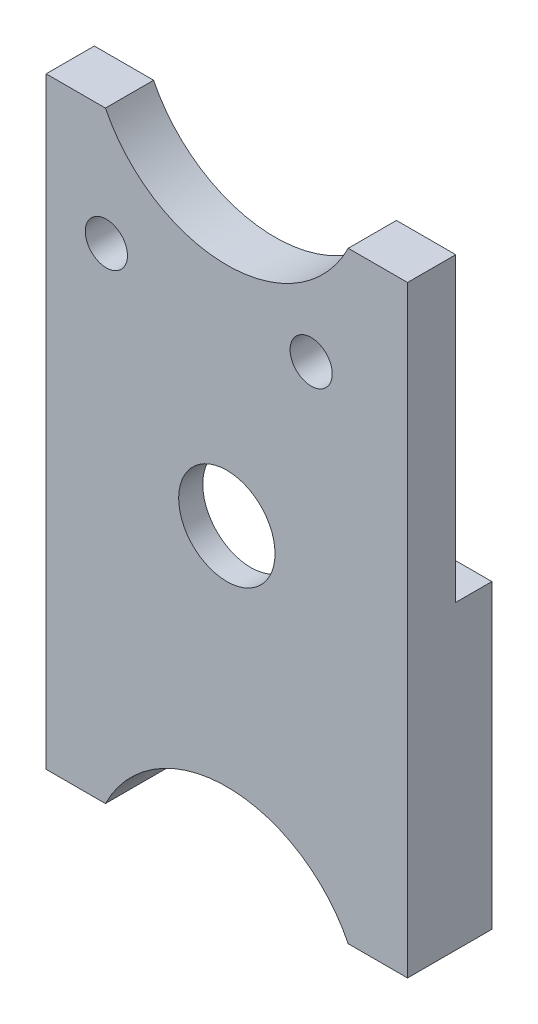
ISO-10303-21;
HEADER;
FILE_DESCRIPTION(('STEP AP214'),'2;1');
FILE_NAME('part.step','',(''),(''),'','','');
FILE_SCHEMA(('AUTOMOTIVE_DESIGN { 1 0 10303 214 1 1 1 1 }'));
ENDSEC;
DATA;
#1=APPLICATION_CONTEXT('core data for automotive mechanical design processes');
#2=APPLICATION_PROTOCOL_DEFINITION('international standard','automotive_design',2000,#1);
#3=PRODUCT_CONTEXT('',#1,'mechanical');
#4=PRODUCT('Part','Part','',(#3));
#5=PRODUCT_RELATED_PRODUCT_CATEGORY('part','',(#4));
#6=PRODUCT_DEFINITION_FORMATION('','',#4);
#7=PRODUCT_DEFINITION_CONTEXT('part definition',#1,'design');
#8=PRODUCT_DEFINITION('design','',#6,#7);
#9=PRODUCT_DEFINITION_SHAPE('','',#8);
#10=(LENGTH_UNIT() NAMED_UNIT(*) SI_UNIT(.MILLI.,.METRE.));
#11=(NAMED_UNIT(*) PLANE_ANGLE_UNIT() SI_UNIT($,.RADIAN.));
#12=(NAMED_UNIT(*) SI_UNIT($,.STERADIAN.) SOLID_ANGLE_UNIT());
#13=UNCERTAINTY_MEASURE_WITH_UNIT(LENGTH_MEASURE(1.E-05),#10,'distance_accuracy_value','');
#14=(GEOMETRIC_REPRESENTATION_CONTEXT(3) GLOBAL_UNCERTAINTY_ASSIGNED_CONTEXT((#13)) GLOBAL_UNIT_ASSIGNED_CONTEXT((#10,
#11,#12)) REPRESENTATION_CONTEXT('',''));
#15=CARTESIAN_POINT('',(0.,0.,0.));
#16=DIRECTION('',(0.,0.,1.));
#17=DIRECTION('',(1.,0.,0.));
#18=AXIS2_PLACEMENT_3D('',#15,#16,#17);
#19=CARTESIAN_POINT('',(0.,0.,7.));
#20=DIRECTION('',(0.,0.,-1.));
#21=DIRECTION('',(-1.,0.,0.));
#22=AXIS2_PLACEMENT_3D('',#19,#20,#21);
#23=CYLINDRICAL_SURFACE('',#22,4.);
#24=CARTESIAN_POINT('',(0.,0.,7.));
#25=DIRECTION('',(0.,0.,1.));
#26=DIRECTION('',(1.,0.,0.));
#27=AXIS2_PLACEMENT_3D('',#24,#25,#26);
#28=CIRCLE('',#27,4.);
#29=CARTESIAN_POINT('',(4.,0.,7.));
#30=VERTEX_POINT('',#29);
#31=EDGE_CURVE('E137',#30,#30,#28,.T.);
#32=ORIENTED_EDGE('',*,*,#31,.T.);
#33=EDGE_LOOP('',(#32));
#34=FACE_BOUND('',#33,.T.);
#35=CARTESIAN_POINT('',(0.,0.,5.));
#36=DIRECTION('',(0.,0.,-1.));
#37=DIRECTION('',(-1.,0.,0.));
#38=AXIS2_PLACEMENT_3D('',#35,#36,#37);
#39=CIRCLE('',#38,4.);
#40=CARTESIAN_POINT('',(-4.,0.,5.));
#41=VERTEX_POINT('',#40);
#42=EDGE_CURVE('E43',#41,#41,#39,.T.);
#43=ORIENTED_EDGE('',*,*,#42,.T.);
#44=EDGE_LOOP('',(#43));
#45=FACE_BOUND('',#44,.T.);
#46=ADVANCED_FACE('F39',(#34,#45),#23,.F.);
#47=CARTESIAN_POINT('',(10.0778221853732,25.,7.));
#48=DIRECTION('',(0.,-1.,0.));
#49=DIRECTION('',(0.,0.,-1.));
#50=AXIS2_PLACEMENT_3D('',#47,#48,#49);
#51=PLANE('',#50);
#52=DIRECTION('',(1.,0.,0.));
#53=VECTOR('',#52,1.);
#54=CARTESIAN_POINT('',(15.,25.,3.));
#55=LINE('',#54,#53);
#56=CARTESIAN_POINT('',(10.0778221853732,25.,3.));
#57=VERTEX_POINT('',#56);
#58=CARTESIAN_POINT('',(15.,25.,3.));
#59=VERTEX_POINT('',#58);
#60=EDGE_CURVE('E241',#57,#59,#55,.T.);
#61=ORIENTED_EDGE('',*,*,#60,.F.);
#62=DIRECTION('',(0.,0.,-1.));
#63=VECTOR('',#62,1.);
#64=CARTESIAN_POINT('',(10.0778221853732,25.,7.));
#65=LINE('',#64,#63);
#66=CARTESIAN_POINT('',(10.0778221853732,25.,7.));
#67=VERTEX_POINT('',#66);
#68=EDGE_CURVE('E48',#67,#57,#65,.T.);
#69=ORIENTED_EDGE('',*,*,#68,.F.);
#70=DIRECTION('',(-1.,0.,0.));
#71=VECTOR('',#70,1.);
#72=CARTESIAN_POINT('',(10.0778221853732,25.,7.));
#73=LINE('',#72,#71);
#74=CARTESIAN_POINT('',(15.,25.,7.));
#75=VERTEX_POINT('',#74);
#76=EDGE_CURVE('E144',#75,#67,#73,.T.);
#77=ORIENTED_EDGE('',*,*,#76,.F.);
#78=DIRECTION('',(0.,0.,-1.));
#79=VECTOR('',#78,1.);
#80=CARTESIAN_POINT('',(15.,25.,7.));
#81=LINE('',#80,#79);
#82=EDGE_CURVE('E130',#75,#59,#81,.T.);
#83=ORIENTED_EDGE('',*,*,#82,.T.);
#84=EDGE_LOOP('',(#61,#69,#77,#83));
#85=FACE_BOUND('',#84,.T.);
#86=ADVANCED_FACE('F41',(#85),#51,.F.);
#87=CARTESIAN_POINT('',(0.,30.,7.));
#88=DIRECTION('',(0.,0.,-1.));
#89=DIRECTION('',(-1.,0.,0.));
#90=AXIS2_PLACEMENT_3D('',#87,#88,#89);
#91=CYLINDRICAL_SURFACE('',#90,11.25);
#92=CARTESIAN_POINT('',(0.,30.,3.));
#93=DIRECTION('',(0.,0.,-1.));
#94=DIRECTION('',(-1.,0.,0.));
#95=AXIS2_PLACEMENT_3D('',#92,#93,#94);
#96=CIRCLE('',#95,11.25);
#97=CARTESIAN_POINT('',(-10.0778221853732,25.,3.));
#98=VERTEX_POINT('',#97);
#99=EDGE_CURVE('E166',#98,#57,#96,.F.);
#100=ORIENTED_EDGE('',*,*,#99,.F.);
#101=DIRECTION('',(0.,0.,-1.));
#102=VECTOR('',#101,1.);
#103=CARTESIAN_POINT('',(-10.0778221853732,25.,7.));
#104=LINE('',#103,#102);
#105=CARTESIAN_POINT('',(-10.0778221853732,25.,7.));
#106=VERTEX_POINT('',#105);
#107=EDGE_CURVE('E155',#106,#98,#104,.T.);
#108=ORIENTED_EDGE('',*,*,#107,.F.);
#109=CARTESIAN_POINT('',(0.,30.,7.));
#110=DIRECTION('',(0.,0.,-1.));
#111=DIRECTION('',(1.,0.,0.));
#112=AXIS2_PLACEMENT_3D('',#109,#110,#111);
#113=CIRCLE('',#112,11.25);
#114=EDGE_CURVE('E94',#67,#106,#113,.T.);
#115=ORIENTED_EDGE('',*,*,#114,.F.);
#116=ORIENTED_EDGE('',*,*,#68,.T.);
#117=EDGE_LOOP('',(#100,#108,#115,#116));
#118=FACE_BOUND('',#117,.T.);
#119=ADVANCED_FACE('F295',(#118),#91,.F.);
#120=CARTESIAN_POINT('',(-15.,25.,7.));
#121=DIRECTION('',(0.,-1.,0.));
#122=DIRECTION('',(0.,0.,-1.));
#123=AXIS2_PLACEMENT_3D('',#120,#121,#122);
#124=PLANE('',#123);
#125=CARTESIAN_POINT('',(-15.,25.,3.));
#126=VERTEX_POINT('',#125);
#127=EDGE_CURVE('E177',#126,#98,#55,.T.);
#128=ORIENTED_EDGE('',*,*,#127,.F.);
#129=DIRECTION('',(0.,0.,-1.));
#130=VECTOR('',#129,1.);
#131=CARTESIAN_POINT('',(-15.,25.,7.));
#132=LINE('',#131,#130);
#133=CARTESIAN_POINT('',(-15.,25.,7.));
#134=VERTEX_POINT('',#133);
#135=EDGE_CURVE('E152',#134,#126,#132,.T.);
#136=ORIENTED_EDGE('',*,*,#135,.F.);
#137=DIRECTION('',(-1.,0.,0.));
#138=VECTOR('',#137,1.);
#139=CARTESIAN_POINT('',(-15.,25.,7.));
#140=LINE('',#139,#138);
#141=EDGE_CURVE('E195',#106,#134,#140,.T.);
#142=ORIENTED_EDGE('',*,*,#141,.F.);
#143=ORIENTED_EDGE('',*,*,#107,.T.);
#144=EDGE_LOOP('',(#128,#136,#142,#143));
#145=FACE_BOUND('',#144,.T.);
#146=ADVANCED_FACE('F319',(#145),#124,.F.);
#147=CARTESIAN_POINT('',(6.99999999999999,15.3,-3.));
#148=DIRECTION('',(0.,0.,1.));
#149=DIRECTION('',(1.,0.,0.));
#150=AXIS2_PLACEMENT_3D('',#147,#148,#149);
#151=CYLINDRICAL_SURFACE('',#150,1.75);
#152=CARTESIAN_POINT('',(6.99999999999999,15.3,7.));
#153=DIRECTION('',(0.,0.,1.));
#154=DIRECTION('',(1.,0.,0.));
#155=AXIS2_PLACEMENT_3D('',#152,#153,#154);
#156=CIRCLE('',#155,1.75);
#157=CARTESIAN_POINT('',(8.74999999999999,15.3,7.));
#158=VERTEX_POINT('',#157);
#159=EDGE_CURVE('E185',#158,#158,#156,.T.);
#160=ORIENTED_EDGE('',*,*,#159,.T.);
#161=EDGE_LOOP('',(#160));
#162=FACE_BOUND('',#161,.T.);
#163=CARTESIAN_POINT('',(6.99999999999999,15.3,3.));
#164=DIRECTION('',(0.,0.,-1.));
#165=DIRECTION('',(-1.,0.,0.));
#166=AXIS2_PLACEMENT_3D('',#163,#164,#165);
#167=CIRCLE('',#166,1.75);
#168=CARTESIAN_POINT('',(5.24999999999999,15.3,3.));
#169=VERTEX_POINT('',#168);
#170=EDGE_CURVE('E161',#169,#169,#167,.F.);
#171=ORIENTED_EDGE('',*,*,#170,.F.);
#172=EDGE_LOOP('',(#171));
#173=FACE_BOUND('',#172,.T.);
#174=ADVANCED_FACE('F300',(#162,#173),#151,.F.);
#175=CARTESIAN_POINT('',(-10.,15.3,-3.));
#176=DIRECTION('',(0.,0.,1.));
#177=DIRECTION('',(1.,0.,0.));
#178=AXIS2_PLACEMENT_3D('',#175,#176,#177);
#179=CYLINDRICAL_SURFACE('',#178,1.75);
#180=CARTESIAN_POINT('',(-10.,15.3,7.));
#181=DIRECTION('',(0.,0.,1.));
#182=DIRECTION('',(1.,0.,0.));
#183=AXIS2_PLACEMENT_3D('',#180,#181,#182);
#184=CIRCLE('',#183,1.75);
#185=CARTESIAN_POINT('',(-8.25000000000001,15.3,7.));
#186=VERTEX_POINT('',#185);
#187=EDGE_CURVE('E186',#186,#186,#184,.T.);
#188=ORIENTED_EDGE('',*,*,#187,.T.);
#189=EDGE_LOOP('',(#188));
#190=FACE_BOUND('',#189,.T.);
#191=CARTESIAN_POINT('',(-10.,15.3,3.));
#192=DIRECTION('',(0.,0.,-1.));
#193=DIRECTION('',(-1.,0.,0.));
#194=AXIS2_PLACEMENT_3D('',#191,#192,#193);
#195=CIRCLE('',#194,1.75);
#196=CARTESIAN_POINT('',(-11.75,15.3,3.));
#197=VERTEX_POINT('',#196);
#198=EDGE_CURVE('E159',#197,#197,#195,.F.);
#199=ORIENTED_EDGE('',*,*,#198,.F.);
#200=EDGE_LOOP('',(#199));
#201=FACE_BOUND('',#200,.T.);
#202=ADVANCED_FACE('F304',(#190,#201),#179,.F.);
#203=CARTESIAN_POINT('',(0.,-30.,7.));
#204=DIRECTION('',(0.,0.,1.));
#205=DIRECTION('',(1.,0.,0.));
#206=AXIS2_PLACEMENT_3D('',#203,#204,#205);
#207=PLANE('',#206);
#208=ORIENTED_EDGE('',*,*,#187,.F.);
#209=EDGE_LOOP('',(#208));
#210=FACE_BOUND('',#209,.T.);
#211=ORIENTED_EDGE('',*,*,#159,.F.);
#212=EDGE_LOOP('',(#211));
#213=FACE_BOUND('',#212,.T.);
#214=ORIENTED_EDGE('',*,*,#76,.T.);
#215=ORIENTED_EDGE('',*,*,#114,.T.);
#216=ORIENTED_EDGE('',*,*,#141,.T.);
#217=DIRECTION('',(0.,-1.,0.));
#218=VECTOR('',#217,1.);
#219=CARTESIAN_POINT('',(-15.,-25.,7.));
#220=LINE('',#219,#218);
#221=CARTESIAN_POINT('',(-15.,-25.,7.));
#222=VERTEX_POINT('',#221);
#223=EDGE_CURVE('E197',#134,#222,#220,.T.);
#224=ORIENTED_EDGE('',*,*,#223,.T.);
#225=DIRECTION('',(1.,0.,0.));
#226=VECTOR('',#225,1.);
#227=CARTESIAN_POINT('',(-15.,-25.,7.));
#228=LINE('',#227,#226);
#229=CARTESIAN_POINT('',(-10.0778221853732,-25.,7.));
#230=VERTEX_POINT('',#229);
#231=EDGE_CURVE('E116',#222,#230,#228,.T.);
#232=ORIENTED_EDGE('',*,*,#231,.T.);
#233=CARTESIAN_POINT('',(0.,-30.,7.));
#234=DIRECTION('',(0.,0.,-1.));
#235=DIRECTION('',(1.,0.,0.));
#236=AXIS2_PLACEMENT_3D('',#233,#234,#235);
#237=CIRCLE('',#236,11.25);
#238=CARTESIAN_POINT('',(10.0778221853732,-25.,7.));
#239=VERTEX_POINT('',#238);
#240=EDGE_CURVE('E109',#230,#239,#237,.T.);
#241=ORIENTED_EDGE('',*,*,#240,.T.);
#242=DIRECTION('',(1.,0.,0.));
#243=VECTOR('',#242,1.);
#244=CARTESIAN_POINT('',(10.0778221853732,-25.,7.));
#245=LINE('',#244,#243);
#246=CARTESIAN_POINT('',(15.,-25.,7.));
#247=VERTEX_POINT('',#246);
#248=EDGE_CURVE('E114',#239,#247,#245,.T.);
#249=ORIENTED_EDGE('',*,*,#248,.T.);
#250=DIRECTION('',(0.,1.,0.));
#251=VECTOR('',#250,1.);
#252=CARTESIAN_POINT('',(15.,-25.,7.));
#253=LINE('',#252,#251);
#254=EDGE_CURVE('E63',#247,#75,#253,.T.);
#255=ORIENTED_EDGE('',*,*,#254,.T.);
#256=EDGE_LOOP('',(#214,#215,#216,#224,#232,#241,#249,#255));
#257=FACE_BOUND('',#256,.T.);
#258=ORIENTED_EDGE('',*,*,#31,.F.);
#259=EDGE_LOOP('',(#258));
#260=FACE_BOUND('',#259,.T.);
#261=ADVANCED_FACE('F111',(#210,#213,#257,#260),#207,.T.);
#262=CARTESIAN_POINT('',(0.,-30.,0.));
#263=DIRECTION('',(0.,0.,1.));
#264=DIRECTION('',(1.,0.,0.));
#265=AXIS2_PLACEMENT_3D('',#262,#263,#264);
#266=PLANE('',#265);
#267=DIRECTION('',(-1.,0.,0.));
#268=VECTOR('',#267,1.);
#269=CARTESIAN_POINT('',(-4.,0.,0.));
#270=LINE('',#269,#268);
#271=CARTESIAN_POINT('',(-11.25,0.,0.));
#272=VERTEX_POINT('',#271);
#273=CARTESIAN_POINT('',(-15.,0.,0.));
#274=VERTEX_POINT('',#273);
#275=EDGE_CURVE('E180',#272,#274,#270,.T.);
#276=ORIENTED_EDGE('',*,*,#275,.F.);
#277=CARTESIAN_POINT('',(0.,0.,0.));
#278=DIRECTION('',(0.,0.,-1.));
#279=DIRECTION('',(-1.,0.,0.));
#280=AXIS2_PLACEMENT_3D('',#277,#278,#279);
#281=CIRCLE('',#280,11.25);
#282=CARTESIAN_POINT('',(11.25,0.,0.));
#283=VERTEX_POINT('',#282);
#284=EDGE_CURVE('E251',#283,#272,#281,.T.);
#285=ORIENTED_EDGE('',*,*,#284,.F.);
#286=DIRECTION('',(-1.,0.,0.));
#287=VECTOR('',#286,1.);
#288=CARTESIAN_POINT('',(15.,0.,0.));
#289=LINE('',#288,#287);
#290=CARTESIAN_POINT('',(15.,0.,0.));
#291=VERTEX_POINT('',#290);
#292=EDGE_CURVE('E214',#291,#283,#289,.T.);
#293=ORIENTED_EDGE('',*,*,#292,.F.);
#294=DIRECTION('',(0.,1.,0.));
#295=VECTOR('',#294,1.);
#296=CARTESIAN_POINT('',(15.,-25.,0.));
#297=LINE('',#296,#295);
#298=CARTESIAN_POINT('',(15.,-25.,0.));
#299=VERTEX_POINT('',#298);
#300=EDGE_CURVE('E141',#299,#291,#297,.T.);
#301=ORIENTED_EDGE('',*,*,#300,.F.);
#302=DIRECTION('',(1.,0.,0.));
#303=VECTOR('',#302,1.);
#304=CARTESIAN_POINT('',(10.0778221853732,-25.,0.));
#305=LINE('',#304,#303);
#306=CARTESIAN_POINT('',(10.0778221853732,-25.,0.));
#307=VERTEX_POINT('',#306);
#308=EDGE_CURVE('E85',#307,#299,#305,.T.);
#309=ORIENTED_EDGE('',*,*,#308,.F.);
#310=CARTESIAN_POINT('',(0.,-30.,0.));
#311=DIRECTION('',(0.,0.,-1.));
#312=DIRECTION('',(1.,0.,0.));
#313=AXIS2_PLACEMENT_3D('',#310,#311,#312);
#314=CIRCLE('',#313,11.25);
#315=CARTESIAN_POINT('',(-10.0778221853732,-25.,0.));
#316=VERTEX_POINT('',#315);
#317=EDGE_CURVE('E124',#316,#307,#314,.T.);
#318=ORIENTED_EDGE('',*,*,#317,.F.);
#319=DIRECTION('',(1.,0.,0.));
#320=VECTOR('',#319,1.);
#321=CARTESIAN_POINT('',(-15.,-25.,0.));
#322=LINE('',#321,#320);
#323=CARTESIAN_POINT('',(-15.,-25.,0.));
#324=VERTEX_POINT('',#323);
#325=EDGE_CURVE('E136',#324,#316,#322,.T.);
#326=ORIENTED_EDGE('',*,*,#325,.F.);
#327=DIRECTION('',(0.,-1.,0.));
#328=VECTOR('',#327,1.);
#329=CARTESIAN_POINT('',(-15.,-25.,0.));
#330=LINE('',#329,#328);
#331=EDGE_CURVE('E134',#274,#324,#330,.T.);
#332=ORIENTED_EDGE('',*,*,#331,.F.);
#333=EDGE_LOOP('',(#276,#285,#293,#301,#309,#318,#326,#332));
#334=FACE_BOUND('',#333,.T.);
#335=ADVANCED_FACE('F208',(#334),#266,.F.);
#336=CARTESIAN_POINT('',(-15.,-25.,7.));
#337=DIRECTION('',(1.,0.,0.));
#338=DIRECTION('',(0.,0.,-1.));
#339=AXIS2_PLACEMENT_3D('',#336,#337,#338);
#340=PLANE('',#339);
#341=DIRECTION('',(0.,1.,0.));
#342=VECTOR('',#341,1.);
#343=CARTESIAN_POINT('',(-15.,25.,3.));
#344=LINE('',#343,#342);
#345=CARTESIAN_POINT('',(-15.,0.,3.));
#346=VERTEX_POINT('',#345);
#347=EDGE_CURVE('E244',#346,#126,#344,.T.);
#348=ORIENTED_EDGE('',*,*,#347,.F.);
#349=DIRECTION('',(0.,0.,-1.));
#350=VECTOR('',#349,1.);
#351=CARTESIAN_POINT('',(-15.,0.,3.));
#352=LINE('',#351,#350);
#353=EDGE_CURVE('E162',#346,#274,#352,.T.);
#354=ORIENTED_EDGE('',*,*,#353,.T.);
#355=ORIENTED_EDGE('',*,*,#331,.T.);
#356=DIRECTION('',(0.,0.,-1.));
#357=VECTOR('',#356,1.);
#358=CARTESIAN_POINT('',(-15.,-25.,7.));
#359=LINE('',#358,#357);
#360=EDGE_CURVE('E149',#222,#324,#359,.T.);
#361=ORIENTED_EDGE('',*,*,#360,.F.);
#362=ORIENTED_EDGE('',*,*,#223,.F.);
#363=ORIENTED_EDGE('',*,*,#135,.T.);
#364=EDGE_LOOP('',(#348,#354,#355,#361,#362,#363));
#365=FACE_BOUND('',#364,.T.);
#366=ADVANCED_FACE('F202',(#365),#340,.F.);
#367=CARTESIAN_POINT('',(-15.,-25.,7.));
#368=DIRECTION('',(0.,1.,0.));
#369=DIRECTION('',(0.,0.,1.));
#370=AXIS2_PLACEMENT_3D('',#367,#368,#369);
#371=PLANE('',#370);
#372=ORIENTED_EDGE('',*,*,#325,.T.);
#373=DIRECTION('',(0.,0.,-1.));
#374=VECTOR('',#373,1.);
#375=CARTESIAN_POINT('',(-10.0778221853732,-25.,7.));
#376=LINE('',#375,#374);
#377=EDGE_CURVE('E125',#230,#316,#376,.T.);
#378=ORIENTED_EDGE('',*,*,#377,.F.);
#379=ORIENTED_EDGE('',*,*,#231,.F.);
#380=ORIENTED_EDGE('',*,*,#360,.T.);
#381=EDGE_LOOP('',(#372,#378,#379,#380));
#382=FACE_BOUND('',#381,.T.);
#383=ADVANCED_FACE('F205',(#382),#371,.F.);
#384=CARTESIAN_POINT('',(0.,-30.,7.));
#385=DIRECTION('',(0.,0.,-1.));
#386=DIRECTION('',(-1.,0.,0.));
#387=AXIS2_PLACEMENT_3D('',#384,#385,#386);
#388=CYLINDRICAL_SURFACE('',#387,11.25);
#389=ORIENTED_EDGE('',*,*,#317,.T.);
#390=DIRECTION('',(0.,0.,-1.));
#391=VECTOR('',#390,1.);
#392=CARTESIAN_POINT('',(10.0778221853732,-25.,7.));
#393=LINE('',#392,#391);
#394=EDGE_CURVE('E121',#239,#307,#393,.T.);
#395=ORIENTED_EDGE('',*,*,#394,.F.);
#396=ORIENTED_EDGE('',*,*,#240,.F.);
#397=ORIENTED_EDGE('',*,*,#377,.T.);
#398=EDGE_LOOP('',(#389,#395,#396,#397));
#399=FACE_BOUND('',#398,.T.);
#400=ADVANCED_FACE('F122',(#399),#388,.F.);
#401=CARTESIAN_POINT('',(10.0778221853732,-25.,7.));
#402=DIRECTION('',(0.,1.,0.));
#403=DIRECTION('',(0.,0.,1.));
#404=AXIS2_PLACEMENT_3D('',#401,#402,#403);
#405=PLANE('',#404);
#406=ORIENTED_EDGE('',*,*,#308,.T.);
#407=DIRECTION('',(0.,0.,-1.));
#408=VECTOR('',#407,1.);
#409=CARTESIAN_POINT('',(15.,-25.,7.));
#410=LINE('',#409,#408);
#411=EDGE_CURVE('E126',#247,#299,#410,.T.);
#412=ORIENTED_EDGE('',*,*,#411,.F.);
#413=ORIENTED_EDGE('',*,*,#248,.F.);
#414=ORIENTED_EDGE('',*,*,#394,.T.);
#415=EDGE_LOOP('',(#406,#412,#413,#414));
#416=FACE_BOUND('',#415,.T.);
#417=ADVANCED_FACE('F128',(#416),#405,.F.);
#418=CARTESIAN_POINT('',(15.,-25.,7.));
#419=DIRECTION('',(-1.,0.,0.));
#420=DIRECTION('',(0.,0.,1.));
#421=AXIS2_PLACEMENT_3D('',#418,#419,#420);
#422=PLANE('',#421);
#423=ORIENTED_EDGE('',*,*,#300,.T.);
#424=DIRECTION('',(0.,0.,-1.));
#425=VECTOR('',#424,1.);
#426=CARTESIAN_POINT('',(15.,0.,3.));
#427=LINE('',#426,#425);
#428=CARTESIAN_POINT('',(15.,0.,3.));
#429=VERTEX_POINT('',#428);
#430=EDGE_CURVE('E169',#429,#291,#427,.T.);
#431=ORIENTED_EDGE('',*,*,#430,.F.);
#432=DIRECTION('',(0.,-1.,0.));
#433=VECTOR('',#432,1.);
#434=CARTESIAN_POINT('',(15.,0.,3.));
#435=LINE('',#434,#433);
#436=EDGE_CURVE('E262',#59,#429,#435,.T.);
#437=ORIENTED_EDGE('',*,*,#436,.F.);
#438=ORIENTED_EDGE('',*,*,#82,.F.);
#439=ORIENTED_EDGE('',*,*,#254,.F.);
#440=ORIENTED_EDGE('',*,*,#411,.T.);
#441=EDGE_LOOP('',(#423,#431,#437,#438,#439,#440));
#442=FACE_BOUND('',#441,.T.);
#443=ADVANCED_FACE('F217',(#442),#422,.F.);
#444=CARTESIAN_POINT('',(0.,0.,3.));
#445=DIRECTION('',(0.,0.,-1.));
#446=DIRECTION('',(-1.,0.,0.));
#447=AXIS2_PLACEMENT_3D('',#444,#445,#446);
#448=PLANE('',#447);
#449=CARTESIAN_POINT('',(0.,0.,3.));
#450=DIRECTION('',(0.,0.,-1.));
#451=DIRECTION('',(-1.,0.,0.));
#452=AXIS2_PLACEMENT_3D('',#449,#450,#451);
#453=CIRCLE('',#452,11.25);
#454=CARTESIAN_POINT('',(-11.25,0.,3.));
#455=VERTEX_POINT('',#454);
#456=CARTESIAN_POINT('',(11.25,0.,3.));
#457=VERTEX_POINT('',#456);
#458=EDGE_CURVE('E55',#455,#457,#453,.T.);
#459=ORIENTED_EDGE('',*,*,#458,.F.);
#460=DIRECTION('',(-1.,0.,0.));
#461=VECTOR('',#460,1.);
#462=CARTESIAN_POINT('',(-4.,0.,3.));
#463=LINE('',#462,#461);
#464=EDGE_CURVE('E260',#455,#346,#463,.T.);
#465=ORIENTED_EDGE('',*,*,#464,.T.);
#466=ORIENTED_EDGE('',*,*,#347,.T.);
#467=ORIENTED_EDGE('',*,*,#127,.T.);
#468=ORIENTED_EDGE('',*,*,#99,.T.);
#469=ORIENTED_EDGE('',*,*,#60,.T.);
#470=ORIENTED_EDGE('',*,*,#436,.T.);
#471=DIRECTION('',(-1.,0.,0.));
#472=VECTOR('',#471,1.);
#473=CARTESIAN_POINT('',(15.,0.,3.));
#474=LINE('',#473,#472);
#475=EDGE_CURVE('E263',#429,#457,#474,.T.);
#476=ORIENTED_EDGE('',*,*,#475,.T.);
#477=EDGE_LOOP('',(#459,#465,#466,#467,#468,#469,#470,#476));
#478=FACE_BOUND('',#477,.T.);
#479=ORIENTED_EDGE('',*,*,#170,.T.);
#480=EDGE_LOOP('',(#479));
#481=FACE_BOUND('',#480,.T.);
#482=ORIENTED_EDGE('',*,*,#198,.T.);
#483=EDGE_LOOP('',(#482));
#484=FACE_BOUND('',#483,.T.);
#485=ADVANCED_FACE('F310',(#478,#481,#484),#448,.T.);
#486=CARTESIAN_POINT('',(-4.,0.,3.));
#487=DIRECTION('',(0.,-1.,0.));
#488=DIRECTION('',(0.,0.,-1.));
#489=AXIS2_PLACEMENT_3D('',#486,#487,#488);
#490=PLANE('',#489);
#491=ORIENTED_EDGE('',*,*,#464,.F.);
#492=DIRECTION('',(0.,0.,-1.));
#493=VECTOR('',#492,1.);
#494=CARTESIAN_POINT('',(-11.25,0.,5.));
#495=LINE('',#494,#493);
#496=EDGE_CURVE('E254',#455,#272,#495,.T.);
#497=ORIENTED_EDGE('',*,*,#496,.T.);
#498=ORIENTED_EDGE('',*,*,#275,.T.);
#499=ORIENTED_EDGE('',*,*,#353,.F.);
#500=EDGE_LOOP('',(#491,#497,#498,#499));
#501=FACE_BOUND('',#500,.T.);
#502=ADVANCED_FACE('F259',(#501),#490,.F.);
#503=CARTESIAN_POINT('',(15.,0.,3.));
#504=DIRECTION('',(0.,-1.,0.));
#505=DIRECTION('',(0.,0.,-1.));
#506=AXIS2_PLACEMENT_3D('',#503,#504,#505);
#507=PLANE('',#506);
#508=ORIENTED_EDGE('',*,*,#292,.T.);
#509=DIRECTION('',(0.,0.,-1.));
#510=VECTOR('',#509,1.);
#511=CARTESIAN_POINT('',(11.25,0.,5.));
#512=LINE('',#511,#510);
#513=EDGE_CURVE('E11',#283,#457,#512,.F.);
#514=ORIENTED_EDGE('',*,*,#513,.T.);
#515=ORIENTED_EDGE('',*,*,#475,.F.);
#516=ORIENTED_EDGE('',*,*,#430,.T.);
#517=EDGE_LOOP('',(#508,#514,#515,#516));
#518=FACE_BOUND('',#517,.T.);
#519=ADVANCED_FACE('F279',(#518),#507,.F.);
#520=CARTESIAN_POINT('',(0.,0.,5.));
#521=DIRECTION('',(0.,0.,-1.));
#522=DIRECTION('',(-1.,0.,0.));
#523=AXIS2_PLACEMENT_3D('',#520,#521,#522);
#524=CYLINDRICAL_SURFACE('',#523,11.25);
#525=CARTESIAN_POINT('',(0.,0.,5.));
#526=DIRECTION('',(0.,0.,-1.));
#527=DIRECTION('',(-1.,0.,0.));
#528=AXIS2_PLACEMENT_3D('',#525,#526,#527);
#529=CIRCLE('',#528,11.25);
#530=CARTESIAN_POINT('',(-11.25,0.,5.));
#531=VERTEX_POINT('',#530);
#532=EDGE_CURVE('E255',#531,#531,#529,.T.);
#533=ORIENTED_EDGE('',*,*,#532,.F.);
#534=EDGE_LOOP('',(#533));
#535=FACE_BOUND('',#534,.T.);
#536=ORIENTED_EDGE('',*,*,#458,.T.);
#537=ORIENTED_EDGE('',*,*,#513,.F.);
#538=ORIENTED_EDGE('',*,*,#284,.T.);
#539=ORIENTED_EDGE('',*,*,#496,.F.);
#540=EDGE_LOOP('',(#536,#537,#538,#539));
#541=FACE_BOUND('',#540,.T.);
#542=ADVANCED_FACE('F253',(#535,#541),#524,.F.);
#543=CARTESIAN_POINT('',(0.,0.,5.));
#544=DIRECTION('',(0.,0.,-1.));
#545=DIRECTION('',(-1.,0.,0.));
#546=AXIS2_PLACEMENT_3D('',#543,#544,#545);
#547=PLANE('',#546);
#548=ORIENTED_EDGE('',*,*,#42,.F.);
#549=EDGE_LOOP('',(#548));
#550=FACE_BOUND('',#549,.T.);
#551=ORIENTED_EDGE('',*,*,#532,.T.);
#552=EDGE_LOOP('',(#551));
#553=FACE_BOUND('',#552,.T.);
#554=ADVANCED_FACE('F276',(#550,#553),#547,.T.);
#555=CLOSED_SHELL('',(#46,#86,#119,#146,#174,#202,#261,#335,#366,#383,#400,#417,#443,#485,#502,
#519,#542,#554));
#556=MANIFOLD_SOLID_BREP('B2',#555);
#557=ADVANCED_BREP_SHAPE_REPRESENTATION('',(#18,#556),#14);
#558=SHAPE_DEFINITION_REPRESENTATION(#9,#557);
ENDSEC;
END-ISO-10303-21;
